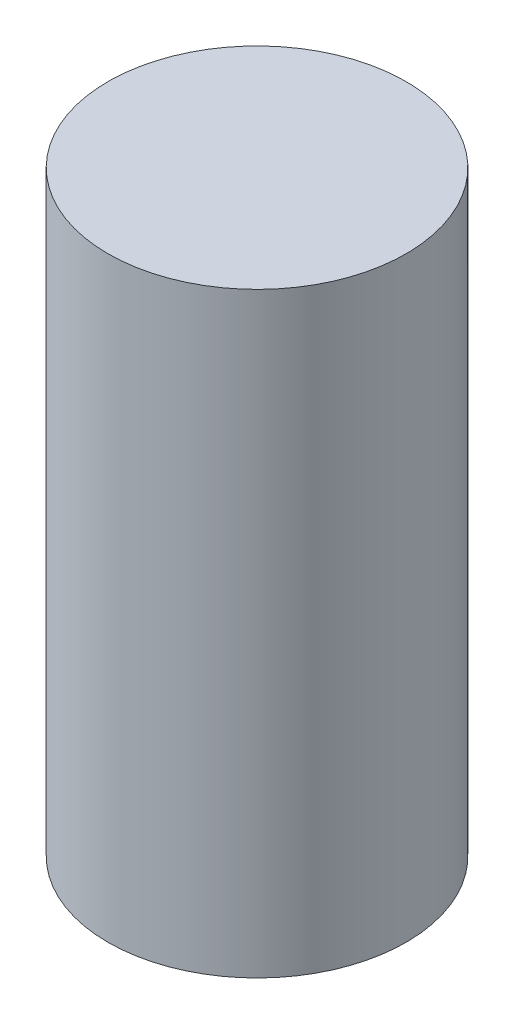
ISO-10303-21;
HEADER;
FILE_DESCRIPTION(('STEP AP214'),'2;1');
FILE_NAME('part.step','',(''),(''),'','','');
FILE_SCHEMA(('AUTOMOTIVE_DESIGN { 1 0 10303 214 1 1 1 1 }'));
ENDSEC;
DATA;
#1=APPLICATION_CONTEXT('core data for automotive mechanical design processes');
#2=APPLICATION_PROTOCOL_DEFINITION('international standard','automotive_design',2000,#1);
#3=PRODUCT_CONTEXT('',#1,'mechanical');
#4=PRODUCT('Part','Part','',(#3));
#5=PRODUCT_RELATED_PRODUCT_CATEGORY('part','',(#4));
#6=PRODUCT_DEFINITION_FORMATION('','',#4);
#7=PRODUCT_DEFINITION_CONTEXT('part definition',#1,'design');
#8=PRODUCT_DEFINITION('design','',#6,#7);
#9=PRODUCT_DEFINITION_SHAPE('','',#8);
#10=(LENGTH_UNIT() NAMED_UNIT(*) SI_UNIT(.MILLI.,.METRE.));
#11=(NAMED_UNIT(*) PLANE_ANGLE_UNIT() SI_UNIT($,.RADIAN.));
#12=(NAMED_UNIT(*) SI_UNIT($,.STERADIAN.) SOLID_ANGLE_UNIT());
#13=UNCERTAINTY_MEASURE_WITH_UNIT(LENGTH_MEASURE(1.E-05),#10,'distance_accuracy_value','');
#14=(GEOMETRIC_REPRESENTATION_CONTEXT(3) GLOBAL_UNCERTAINTY_ASSIGNED_CONTEXT((#13)) GLOBAL_UNIT_ASSIGNED_CONTEXT((#10,
#11,#12)) REPRESENTATION_CONTEXT('',''));
#15=CARTESIAN_POINT('',(0.,0.,0.));
#16=DIRECTION('',(0.,0.,1.));
#17=DIRECTION('',(1.,0.,0.));
#18=AXIS2_PLACEMENT_3D('',#15,#16,#17);
#19=CARTESIAN_POINT('',(0.,5.,0.));
#20=DIRECTION('',(0.,-1.,0.));
#21=DIRECTION('',(0.,0.,-1.));
#22=AXIS2_PLACEMENT_3D('',#19,#20,#21);
#23=CYLINDRICAL_SURFACE('',#22,1.25);
#24=CARTESIAN_POINT('',(0.,5.,0.));
#25=DIRECTION('',(0.,1.,0.));
#26=DIRECTION('',(0.,0.,1.));
#27=AXIS2_PLACEMENT_3D('',#24,#25,#26);
#28=CIRCLE('',#27,1.25);
#29=CARTESIAN_POINT('',(0.,5.,1.25));
#30=VERTEX_POINT('',#29);
#31=EDGE_CURVE('E10',#30,#30,#28,.T.);
#32=ORIENTED_EDGE('',*,*,#31,.F.);
#33=EDGE_LOOP('',(#32));
#34=FACE_BOUND('',#33,.T.);
#35=CARTESIAN_POINT('',(0.,0.,0.));
#36=DIRECTION('',(0.,1.,0.));
#37=DIRECTION('',(0.,0.,1.));
#38=AXIS2_PLACEMENT_3D('',#35,#36,#37);
#39=CIRCLE('',#38,1.25);
#40=CARTESIAN_POINT('',(0.,0.,1.25));
#41=VERTEX_POINT('',#40);
#42=EDGE_CURVE('E34',#41,#41,#39,.T.);
#43=ORIENTED_EDGE('',*,*,#42,.T.);
#44=EDGE_LOOP('',(#43));
#45=FACE_BOUND('',#44,.T.);
#46=ADVANCED_FACE('F31',(#34,#45),#23,.T.);
#47=CARTESIAN_POINT('',(0.,5.,0.));
#48=DIRECTION('',(0.,1.,0.));
#49=DIRECTION('',(0.,0.,1.));
#50=AXIS2_PLACEMENT_3D('',#47,#48,#49);
#51=PLANE('',#50);
#52=ORIENTED_EDGE('',*,*,#31,.T.);
#53=EDGE_LOOP('',(#52));
#54=FACE_BOUND('',#53,.T.);
#55=ADVANCED_FACE('F46',(#54),#51,.T.);
#56=CARTESIAN_POINT('',(0.,0.,0.));
#57=DIRECTION('',(0.,1.,0.));
#58=DIRECTION('',(0.,0.,1.));
#59=AXIS2_PLACEMENT_3D('',#56,#57,#58);
#60=PLANE('',#59);
#61=ORIENTED_EDGE('',*,*,#42,.F.);
#62=EDGE_LOOP('',(#61));
#63=FACE_BOUND('',#62,.T.);
#64=ADVANCED_FACE('F44',(#63),#60,.F.);
#65=CLOSED_SHELL('',(#46,#55,#64));
#66=MANIFOLD_SOLID_BREP('B2',#65);
#67=ADVANCED_BREP_SHAPE_REPRESENTATION('',(#18,#66),#14);
#68=SHAPE_DEFINITION_REPRESENTATION(#9,#67);
ENDSEC;
END-ISO-10303-21;
